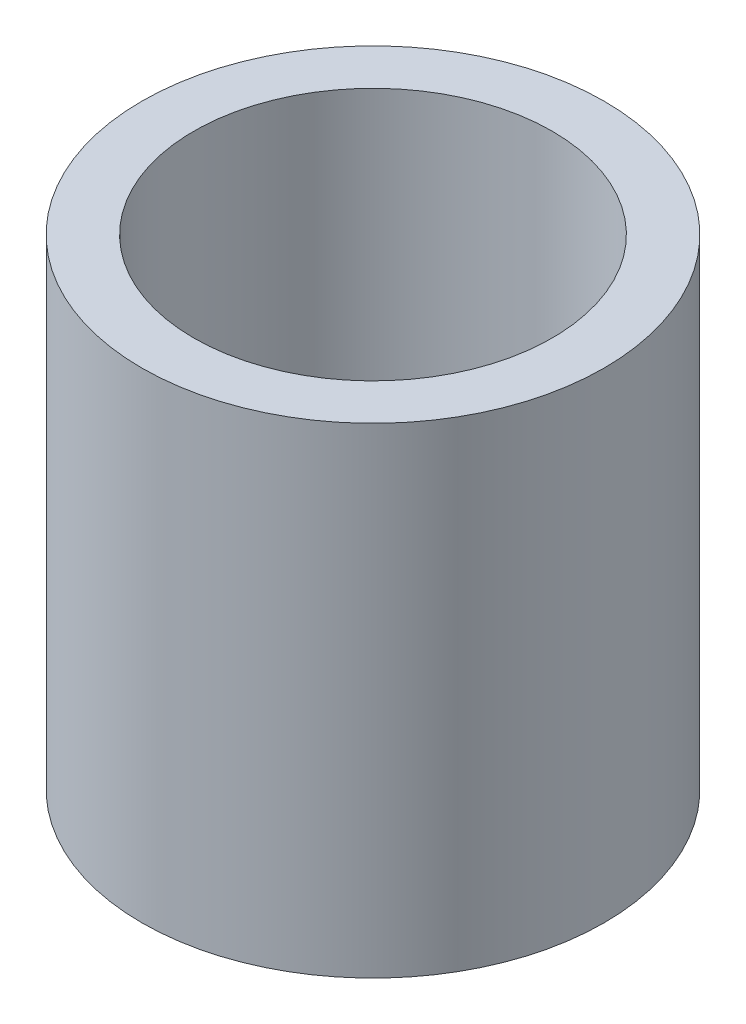
ISO-10303-21;
HEADER;
FILE_DESCRIPTION(('STEP AP214'),'2;1');
FILE_NAME('part.step','',(''),(''),'','','');
FILE_SCHEMA(('AUTOMOTIVE_DESIGN { 1 0 10303 214 1 1 1 1 }'));
ENDSEC;
DATA;
#1=APPLICATION_CONTEXT('core data for automotive mechanical design processes');
#2=APPLICATION_PROTOCOL_DEFINITION('international standard','automotive_design',2000,#1);
#3=PRODUCT_CONTEXT('',#1,'mechanical');
#4=PRODUCT('Part','Part','',(#3));
#5=PRODUCT_RELATED_PRODUCT_CATEGORY('part','',(#4));
#6=PRODUCT_DEFINITION_FORMATION('','',#4);
#7=PRODUCT_DEFINITION_CONTEXT('part definition',#1,'design');
#8=PRODUCT_DEFINITION('design','',#6,#7);
#9=PRODUCT_DEFINITION_SHAPE('','',#8);
#10=(LENGTH_UNIT() NAMED_UNIT(*) SI_UNIT(.MILLI.,.METRE.));
#11=(NAMED_UNIT(*) PLANE_ANGLE_UNIT() SI_UNIT($,.RADIAN.));
#12=(NAMED_UNIT(*) SI_UNIT($,.STERADIAN.) SOLID_ANGLE_UNIT());
#13=UNCERTAINTY_MEASURE_WITH_UNIT(LENGTH_MEASURE(1.E-05),#10,'distance_accuracy_value','');
#14=(GEOMETRIC_REPRESENTATION_CONTEXT(3) GLOBAL_UNCERTAINTY_ASSIGNED_CONTEXT((#13)) GLOBAL_UNIT_ASSIGNED_CONTEXT((#10,
#11,#12)) REPRESENTATION_CONTEXT('',''));
#15=CARTESIAN_POINT('',(0.,0.,0.));
#16=DIRECTION('',(0.,0.,1.));
#17=DIRECTION('',(1.,0.,0.));
#18=AXIS2_PLACEMENT_3D('',#15,#16,#17);
#19=CARTESIAN_POINT('',(0.,18.5,0.));
#20=DIRECTION('',(0.,1.,0.));
#21=DIRECTION('',(0.,0.,1.));
#22=AXIS2_PLACEMENT_3D('',#19,#20,#21);
#23=PLANE('',#22);
#24=CARTESIAN_POINT('',(0.,18.5,0.));
#25=DIRECTION('',(0.,1.,0.));
#26=DIRECTION('',(0.,0.,1.));
#27=AXIS2_PLACEMENT_3D('',#24,#25,#26);
#28=CIRCLE('',#27,8.9);
#29=CARTESIAN_POINT('',(0.,18.5,8.9));
#30=VERTEX_POINT('',#29);
#31=EDGE_CURVE('E10',#30,#30,#28,.T.);
#32=ORIENTED_EDGE('',*,*,#31,.T.);
#33=EDGE_LOOP('',(#32));
#34=FACE_BOUND('',#33,.T.);
#35=CARTESIAN_POINT('',(0.,18.5,0.));
#36=DIRECTION('',(0.,1.,0.));
#37=DIRECTION('',(0.,0.,1.));
#38=AXIS2_PLACEMENT_3D('',#35,#36,#37);
#39=CIRCLE('',#38,6.9);
#40=CARTESIAN_POINT('',(0.,18.5,6.9));
#41=VERTEX_POINT('',#40);
#42=EDGE_CURVE('E42',#41,#41,#39,.T.);
#43=ORIENTED_EDGE('',*,*,#42,.F.);
#44=EDGE_LOOP('',(#43));
#45=FACE_BOUND('',#44,.T.);
#46=ADVANCED_FACE('F31',(#34,#45),#23,.T.);
#47=CARTESIAN_POINT('',(0.,0.,0.));
#48=DIRECTION('',(0.,1.,0.));
#49=DIRECTION('',(0.,0.,1.));
#50=AXIS2_PLACEMENT_3D('',#47,#48,#49);
#51=PLANE('',#50);
#52=CARTESIAN_POINT('',(0.,0.,0.));
#53=DIRECTION('',(0.,1.,0.));
#54=DIRECTION('',(0.,0.,1.));
#55=AXIS2_PLACEMENT_3D('',#52,#53,#54);
#56=CIRCLE('',#55,8.9);
#57=CARTESIAN_POINT('',(0.,0.,8.9));
#58=VERTEX_POINT('',#57);
#59=EDGE_CURVE('E35',#58,#58,#56,.T.);
#60=ORIENTED_EDGE('',*,*,#59,.F.);
#61=EDGE_LOOP('',(#60));
#62=FACE_BOUND('',#61,.T.);
#63=CARTESIAN_POINT('',(0.,0.,0.));
#64=DIRECTION('',(0.,1.,0.));
#65=DIRECTION('',(0.,0.,1.));
#66=AXIS2_PLACEMENT_3D('',#63,#64,#65);
#67=CIRCLE('',#66,6.9);
#68=CARTESIAN_POINT('',(0.,0.,6.9));
#69=VERTEX_POINT('',#68);
#70=EDGE_CURVE('E44',#69,#69,#67,.T.);
#71=ORIENTED_EDGE('',*,*,#70,.T.);
#72=EDGE_LOOP('',(#71));
#73=FACE_BOUND('',#72,.T.);
#74=ADVANCED_FACE('F54',(#62,#73),#51,.F.);
#75=CARTESIAN_POINT('',(0.,18.5,0.));
#76=DIRECTION('',(0.,-1.,0.));
#77=DIRECTION('',(0.,0.,-1.));
#78=AXIS2_PLACEMENT_3D('',#75,#76,#77);
#79=CYLINDRICAL_SURFACE('',#78,8.9);
#80=ORIENTED_EDGE('',*,*,#31,.F.);
#81=EDGE_LOOP('',(#80));
#82=FACE_BOUND('',#81,.T.);
#83=ORIENTED_EDGE('',*,*,#59,.T.);
#84=EDGE_LOOP('',(#83));
#85=FACE_BOUND('',#84,.T.);
#86=ADVANCED_FACE('F33',(#82,#85),#79,.T.);
#87=CARTESIAN_POINT('',(0.,18.5,0.));
#88=DIRECTION('',(0.,-1.,0.));
#89=DIRECTION('',(0.,0.,-1.));
#90=AXIS2_PLACEMENT_3D('',#87,#88,#89);
#91=CYLINDRICAL_SURFACE('',#90,6.9);
#92=ORIENTED_EDGE('',*,*,#42,.T.);
#93=EDGE_LOOP('',(#92));
#94=FACE_BOUND('',#93,.T.);
#95=ORIENTED_EDGE('',*,*,#70,.F.);
#96=EDGE_LOOP('',(#95));
#97=FACE_BOUND('',#96,.T.);
#98=ADVANCED_FACE('F50',(#94,#97),#91,.F.);
#99=CLOSED_SHELL('',(#46,#74,#86,#98));
#100=MANIFOLD_SOLID_BREP('B2',#99);
#101=ADVANCED_BREP_SHAPE_REPRESENTATION('',(#18,#100),#14);
#102=SHAPE_DEFINITION_REPRESENTATION(#9,#101);
ENDSEC;
END-ISO-10303-21;
